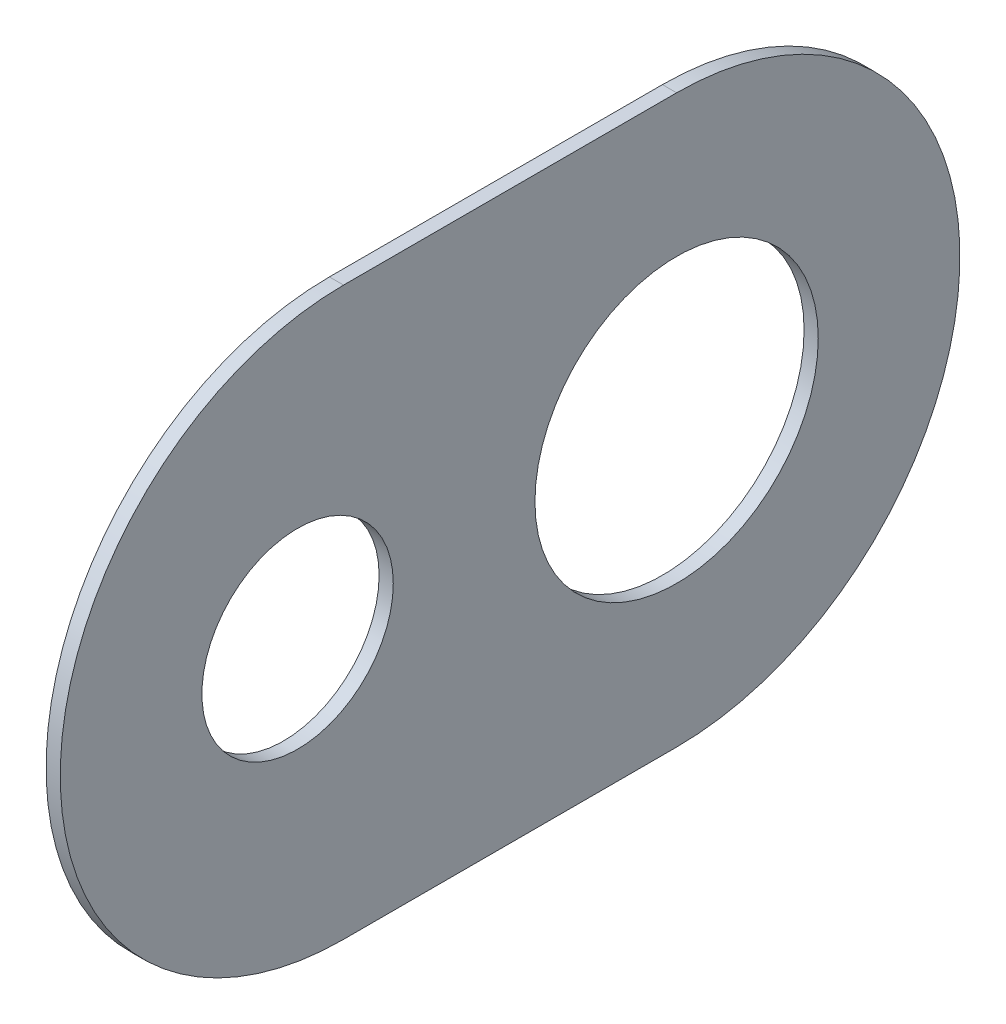
ISO-10303-21;
HEADER;
FILE_DESCRIPTION(('STEP AP214'),'2;1');
FILE_NAME('part.step','',(''),(''),'','','');
FILE_SCHEMA(('AUTOMOTIVE_DESIGN { 1 0 10303 214 1 1 1 1 }'));
ENDSEC;
DATA;
#1=APPLICATION_CONTEXT('core data for automotive mechanical design processes');
#2=APPLICATION_PROTOCOL_DEFINITION('international standard','automotive_design',2000,#1);
#3=PRODUCT_CONTEXT('',#1,'mechanical');
#4=PRODUCT('Part','Part','',(#3));
#5=PRODUCT_RELATED_PRODUCT_CATEGORY('part','',(#4));
#6=PRODUCT_DEFINITION_FORMATION('','',#4);
#7=PRODUCT_DEFINITION_CONTEXT('part definition',#1,'design');
#8=PRODUCT_DEFINITION('design','',#6,#7);
#9=PRODUCT_DEFINITION_SHAPE('','',#8);
#10=(LENGTH_UNIT() NAMED_UNIT(*) SI_UNIT(.MILLI.,.METRE.));
#11=(NAMED_UNIT(*) PLANE_ANGLE_UNIT() SI_UNIT($,.RADIAN.));
#12=(NAMED_UNIT(*) SI_UNIT($,.STERADIAN.) SOLID_ANGLE_UNIT());
#13=UNCERTAINTY_MEASURE_WITH_UNIT(LENGTH_MEASURE(1.E-05),#10,'distance_accuracy_value','');
#14=(GEOMETRIC_REPRESENTATION_CONTEXT(3) GLOBAL_UNCERTAINTY_ASSIGNED_CONTEXT((#13)) GLOBAL_UNIT_ASSIGNED_CONTEXT((#10,
#11,#12)) REPRESENTATION_CONTEXT('',''));
#15=CARTESIAN_POINT('',(0.,0.,0.));
#16=DIRECTION('',(0.,0.,1.));
#17=DIRECTION('',(1.,0.,0.));
#18=AXIS2_PLACEMENT_3D('',#15,#16,#17);
#19=CARTESIAN_POINT('',(1.27,0.,-14.92884996825));
#20=DIRECTION('',(1.,0.,0.));
#21=DIRECTION('',(0.,0.,-1.));
#22=AXIS2_PLACEMENT_3D('',#19,#20,#21);
#23=PLANE('',#22);
#24=CARTESIAN_POINT('',(1.27,0.,19.04999996825));
#25=DIRECTION('',(1.,0.,0.));
#26=DIRECTION('',(0.,0.,-1.));
#27=AXIS2_PLACEMENT_3D('',#24,#25,#26);
#28=CIRCLE('',#27,8.57885);
#29=CARTESIAN_POINT('',(1.27,0.,10.47114996825));
#30=VERTEX_POINT('',#29);
#31=EDGE_CURVE('E107',#30,#30,#28,.T.);
#32=ORIENTED_EDGE('',*,*,#31,.F.);
#33=EDGE_LOOP('',(#32));
#34=FACE_BOUND('',#33,.T.);
#35=CARTESIAN_POINT('',(1.27,0.,-14.92884996825));
#36=DIRECTION('',(1.,0.,0.));
#37=DIRECTION('',(0.,0.,-1.));
#38=AXIS2_PLACEMENT_3D('',#35,#36,#37);
#39=CIRCLE('',#38,25.3999999365);
#40=CARTESIAN_POINT('',(1.27,-25.3999999365,-14.92884996825));
#41=VERTEX_POINT('',#40);
#42=CARTESIAN_POINT('',(1.27,25.3999999365,-14.92884996825));
#43=VERTEX_POINT('',#42);
#44=EDGE_CURVE('E91',#41,#43,#39,.T.);
#45=ORIENTED_EDGE('',*,*,#44,.T.);
#46=DIRECTION('',(0.,0.,1.));
#47=VECTOR('',#46,1.);
#48=CARTESIAN_POINT('',(1.27,25.3999999365,-14.92884996825));
#49=LINE('',#48,#47);
#50=CARTESIAN_POINT('',(1.27,25.3999999365,14.92884996825));
#51=VERTEX_POINT('',#50);
#52=EDGE_CURVE('E86',#43,#51,#49,.T.);
#53=ORIENTED_EDGE('',*,*,#52,.T.);
#54=CARTESIAN_POINT('',(1.27,0.,14.92884996825));
#55=DIRECTION('',(1.,0.,0.));
#56=DIRECTION('',(0.,0.,-1.));
#57=AXIS2_PLACEMENT_3D('',#54,#55,#56);
#58=CIRCLE('',#57,25.3999999365);
#59=CARTESIAN_POINT('',(1.27,-25.3999999365,14.92884996825));
#60=VERTEX_POINT('',#59);
#61=EDGE_CURVE('E93',#51,#60,#58,.T.);
#62=ORIENTED_EDGE('',*,*,#61,.T.);
#63=DIRECTION('',(0.,0.,-1.));
#64=VECTOR('',#63,1.);
#65=CARTESIAN_POINT('',(1.27,-25.3999999365,-14.92884996825));
#66=LINE('',#65,#64);
#67=EDGE_CURVE('E59',#60,#41,#66,.T.);
#68=ORIENTED_EDGE('',*,*,#67,.T.);
#69=EDGE_LOOP('',(#45,#53,#62,#68));
#70=FACE_BOUND('',#69,.T.);
#71=CARTESIAN_POINT('',(1.27,0.,-14.92884996825));
#72=DIRECTION('',(1.,0.,0.));
#73=DIRECTION('',(0.,0.,-1.));
#74=AXIS2_PLACEMENT_3D('',#71,#72,#73);
#75=CIRCLE('',#74,12.7);
#76=CARTESIAN_POINT('',(1.27,0.,-27.62884996825));
#77=VERTEX_POINT('',#76);
#78=EDGE_CURVE('E124',#77,#77,#75,.T.);
#79=ORIENTED_EDGE('',*,*,#78,.F.);
#80=EDGE_LOOP('',(#79));
#81=FACE_BOUND('',#80,.T.);
#82=ADVANCED_FACE('F41',(#34,#70,#81),#23,.T.);
#83=CARTESIAN_POINT('',(0.,0.,-14.92884996825));
#84=DIRECTION('',(1.,0.,0.));
#85=DIRECTION('',(0.,0.,-1.));
#86=AXIS2_PLACEMENT_3D('',#83,#84,#85);
#87=PLANE('',#86);
#88=CARTESIAN_POINT('',(0.,0.,-14.92884996825));
#89=DIRECTION('',(1.,0.,0.));
#90=DIRECTION('',(0.,0.,-1.));
#91=AXIS2_PLACEMENT_3D('',#88,#89,#90);
#92=CIRCLE('',#91,25.3999999365);
#93=CARTESIAN_POINT('',(0.,-25.3999999365,-14.92884996825));
#94=VERTEX_POINT('',#93);
#95=CARTESIAN_POINT('',(0.,25.3999999365,-14.92884996825));
#96=VERTEX_POINT('',#95);
#97=EDGE_CURVE('E104',#94,#96,#92,.T.);
#98=ORIENTED_EDGE('',*,*,#97,.F.);
#99=DIRECTION('',(0.,0.,-1.));
#100=VECTOR('',#99,1.);
#101=CARTESIAN_POINT('',(0.,-25.3999999365,-14.92884996825));
#102=LINE('',#101,#100);
#103=CARTESIAN_POINT('',(0.,-25.3999999365,14.92884996825));
#104=VERTEX_POINT('',#103);
#105=EDGE_CURVE('E81',#104,#94,#102,.T.);
#106=ORIENTED_EDGE('',*,*,#105,.F.);
#107=CARTESIAN_POINT('',(0.,0.,14.92884996825));
#108=DIRECTION('',(1.,0.,0.));
#109=DIRECTION('',(0.,0.,-1.));
#110=AXIS2_PLACEMENT_3D('',#107,#108,#109);
#111=CIRCLE('',#110,25.3999999365);
#112=CARTESIAN_POINT('',(0.,25.3999999365,14.92884996825));
#113=VERTEX_POINT('',#112);
#114=EDGE_CURVE('E73',#113,#104,#111,.T.);
#115=ORIENTED_EDGE('',*,*,#114,.F.);
#116=DIRECTION('',(0.,0.,1.));
#117=VECTOR('',#116,1.);
#118=CARTESIAN_POINT('',(0.,25.3999999365,-14.92884996825));
#119=LINE('',#118,#117);
#120=EDGE_CURVE('E100',#96,#113,#119,.T.);
#121=ORIENTED_EDGE('',*,*,#120,.F.);
#122=EDGE_LOOP('',(#98,#106,#115,#121));
#123=FACE_BOUND('',#122,.T.);
#124=CARTESIAN_POINT('',(0.,0.,19.04999996825));
#125=DIRECTION('',(1.,0.,0.));
#126=DIRECTION('',(0.,0.,-1.));
#127=AXIS2_PLACEMENT_3D('',#124,#125,#126);
#128=CIRCLE('',#127,8.57885);
#129=CARTESIAN_POINT('',(0.,0.,10.47114996825));
#130=VERTEX_POINT('',#129);
#131=EDGE_CURVE('E118',#130,#130,#128,.T.);
#132=ORIENTED_EDGE('',*,*,#131,.T.);
#133=EDGE_LOOP('',(#132));
#134=FACE_BOUND('',#133,.T.);
#135=CARTESIAN_POINT('',(0.,0.,-14.92884996825));
#136=DIRECTION('',(1.,0.,0.));
#137=DIRECTION('',(0.,0.,-1.));
#138=AXIS2_PLACEMENT_3D('',#135,#136,#137);
#139=CIRCLE('',#138,12.7);
#140=CARTESIAN_POINT('',(0.,0.,-27.62884996825));
#141=VERTEX_POINT('',#140);
#142=EDGE_CURVE('E127',#141,#141,#139,.T.);
#143=ORIENTED_EDGE('',*,*,#142,.T.);
#144=EDGE_LOOP('',(#143));
#145=FACE_BOUND('',#144,.T.);
#146=ADVANCED_FACE('F117',(#123,#134,#145),#87,.F.);
#147=CARTESIAN_POINT('',(1.27,0.,-14.92884996825));
#148=DIRECTION('',(-1.,0.,0.));
#149=DIRECTION('',(0.,0.,1.));
#150=AXIS2_PLACEMENT_3D('',#147,#148,#149);
#151=CYLINDRICAL_SURFACE('',#150,25.3999999365);
#152=ORIENTED_EDGE('',*,*,#97,.T.);
#153=DIRECTION('',(-1.,0.,0.));
#154=VECTOR('',#153,1.);
#155=CARTESIAN_POINT('',(1.27,25.3999999365,-14.92884996825));
#156=LINE('',#155,#154);
#157=EDGE_CURVE('E11',#43,#96,#156,.T.);
#158=ORIENTED_EDGE('',*,*,#157,.F.);
#159=ORIENTED_EDGE('',*,*,#44,.F.);
#160=DIRECTION('',(-1.,0.,0.));
#161=VECTOR('',#160,1.);
#162=CARTESIAN_POINT('',(1.27,-25.3999999365,-14.92884996825));
#163=LINE('',#162,#161);
#164=EDGE_CURVE('E101',#41,#94,#163,.T.);
#165=ORIENTED_EDGE('',*,*,#164,.T.);
#166=EDGE_LOOP('',(#152,#158,#159,#165));
#167=FACE_BOUND('',#166,.T.);
#168=ADVANCED_FACE('F43',(#167),#151,.T.);
#169=CARTESIAN_POINT('',(1.27,25.3999999365,-14.92884996825));
#170=DIRECTION('',(0.,-1.,0.));
#171=DIRECTION('',(0.,0.,-1.));
#172=AXIS2_PLACEMENT_3D('',#169,#170,#171);
#173=PLANE('',#172);
#174=ORIENTED_EDGE('',*,*,#120,.T.);
#175=DIRECTION('',(-1.,0.,0.));
#176=VECTOR('',#175,1.);
#177=CARTESIAN_POINT('',(1.27,25.3999999365,14.92884996825));
#178=LINE('',#177,#176);
#179=EDGE_CURVE('E49',#51,#113,#178,.T.);
#180=ORIENTED_EDGE('',*,*,#179,.F.);
#181=ORIENTED_EDGE('',*,*,#52,.F.);
#182=ORIENTED_EDGE('',*,*,#157,.T.);
#183=EDGE_LOOP('',(#174,#180,#181,#182));
#184=FACE_BOUND('',#183,.T.);
#185=ADVANCED_FACE('F96',(#184),#173,.F.);
#186=CARTESIAN_POINT('',(1.27,0.,14.92884996825));
#187=DIRECTION('',(-1.,0.,0.));
#188=DIRECTION('',(0.,0.,1.));
#189=AXIS2_PLACEMENT_3D('',#186,#187,#188);
#190=CYLINDRICAL_SURFACE('',#189,25.3999999365);
#191=ORIENTED_EDGE('',*,*,#114,.T.);
#192=DIRECTION('',(-1.,0.,0.));
#193=VECTOR('',#192,1.);
#194=CARTESIAN_POINT('',(1.27,-25.3999999365,14.92884996825));
#195=LINE('',#194,#193);
#196=EDGE_CURVE('E98',#60,#104,#195,.T.);
#197=ORIENTED_EDGE('',*,*,#196,.F.);
#198=ORIENTED_EDGE('',*,*,#61,.F.);
#199=ORIENTED_EDGE('',*,*,#179,.T.);
#200=EDGE_LOOP('',(#191,#197,#198,#199));
#201=FACE_BOUND('',#200,.T.);
#202=ADVANCED_FACE('F97',(#201),#190,.T.);
#203=CARTESIAN_POINT('',(1.27,-25.3999999365,-14.92884996825));
#204=DIRECTION('',(0.,1.,0.));
#205=DIRECTION('',(0.,0.,1.));
#206=AXIS2_PLACEMENT_3D('',#203,#204,#205);
#207=PLANE('',#206);
#208=ORIENTED_EDGE('',*,*,#105,.T.);
#209=ORIENTED_EDGE('',*,*,#164,.F.);
#210=ORIENTED_EDGE('',*,*,#67,.F.);
#211=ORIENTED_EDGE('',*,*,#196,.T.);
#212=EDGE_LOOP('',(#208,#209,#210,#211));
#213=FACE_BOUND('',#212,.T.);
#214=ADVANCED_FACE('F114',(#213),#207,.F.);
#215=CARTESIAN_POINT('',(1.27,0.,19.04999996825));
#216=DIRECTION('',(-1.,0.,0.));
#217=DIRECTION('',(0.,0.,1.));
#218=AXIS2_PLACEMENT_3D('',#215,#216,#217);
#219=CYLINDRICAL_SURFACE('',#218,8.57885);
#220=ORIENTED_EDGE('',*,*,#31,.T.);
#221=EDGE_LOOP('',(#220));
#222=FACE_BOUND('',#221,.T.);
#223=ORIENTED_EDGE('',*,*,#131,.F.);
#224=EDGE_LOOP('',(#223));
#225=FACE_BOUND('',#224,.T.);
#226=ADVANCED_FACE('F141',(#222,#225),#219,.F.);
#227=CARTESIAN_POINT('',(1.27,0.,-14.92884996825));
#228=DIRECTION('',(-1.,0.,0.));
#229=DIRECTION('',(0.,0.,1.));
#230=AXIS2_PLACEMENT_3D('',#227,#228,#229);
#231=CYLINDRICAL_SURFACE('',#230,12.7);
#232=ORIENTED_EDGE('',*,*,#78,.T.);
#233=EDGE_LOOP('',(#232));
#234=FACE_BOUND('',#233,.T.);
#235=ORIENTED_EDGE('',*,*,#142,.F.);
#236=EDGE_LOOP('',(#235));
#237=FACE_BOUND('',#236,.T.);
#238=ADVANCED_FACE('F135',(#234,#237),#231,.F.);
#239=CLOSED_SHELL('',(#82,#146,#168,#185,#202,#214,#226,#238));
#240=MANIFOLD_SOLID_BREP('B2',#239);
#241=ADVANCED_BREP_SHAPE_REPRESENTATION('',(#18,#240),#14);
#242=SHAPE_DEFINITION_REPRESENTATION(#9,#241);
ENDSEC;
END-ISO-10303-21;
